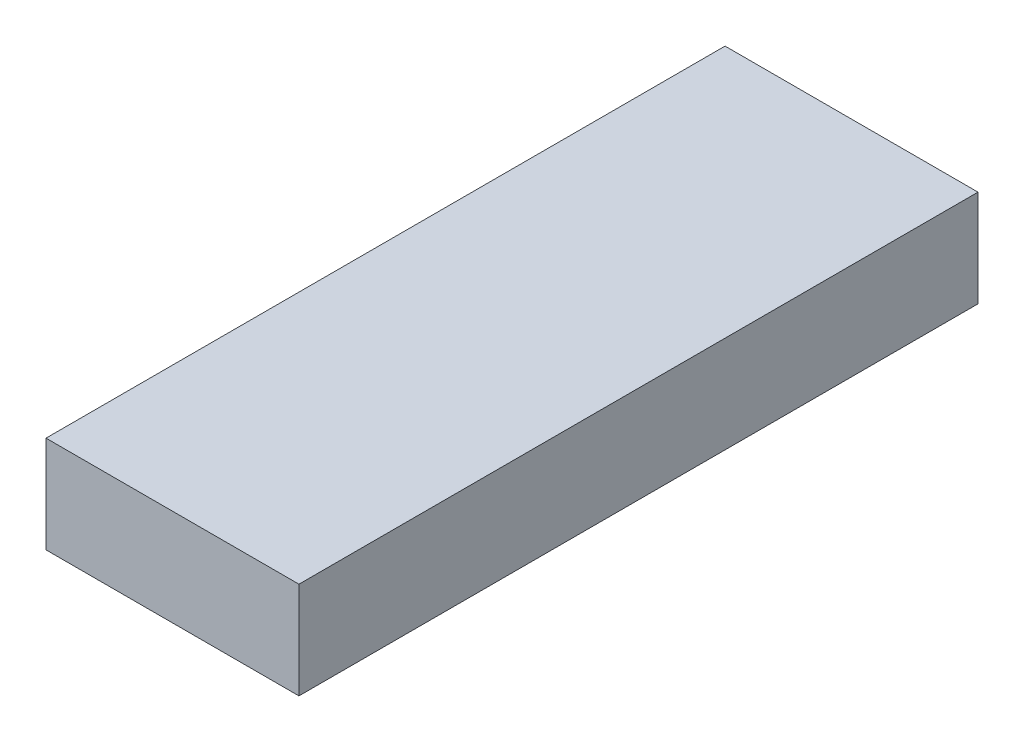
ISO-10303-21;
HEADER;
FILE_DESCRIPTION(('STEP AP214'),'2;1');
FILE_NAME('part.step','',(''),(''),'','','');
FILE_SCHEMA(('AUTOMOTIVE_DESIGN { 1 0 10303 214 1 1 1 1 }'));
ENDSEC;
DATA;
#1=APPLICATION_CONTEXT('core data for automotive mechanical design processes');
#2=APPLICATION_PROTOCOL_DEFINITION('international standard','automotive_design',2000,#1);
#3=PRODUCT_CONTEXT('',#1,'mechanical');
#4=PRODUCT('Part','Part','',(#3));
#5=PRODUCT_RELATED_PRODUCT_CATEGORY('part','',(#4));
#6=PRODUCT_DEFINITION_FORMATION('','',#4);
#7=PRODUCT_DEFINITION_CONTEXT('part definition',#1,'design');
#8=PRODUCT_DEFINITION('design','',#6,#7);
#9=PRODUCT_DEFINITION_SHAPE('','',#8);
#10=(LENGTH_UNIT() NAMED_UNIT(*) SI_UNIT(.MILLI.,.METRE.));
#11=(NAMED_UNIT(*) PLANE_ANGLE_UNIT() SI_UNIT($,.RADIAN.));
#12=(NAMED_UNIT(*) SI_UNIT($,.STERADIAN.) SOLID_ANGLE_UNIT());
#13=UNCERTAINTY_MEASURE_WITH_UNIT(LENGTH_MEASURE(1.E-05),#10,'distance_accuracy_value','');
#14=(GEOMETRIC_REPRESENTATION_CONTEXT(3) GLOBAL_UNCERTAINTY_ASSIGNED_CONTEXT((#13)) GLOBAL_UNIT_ASSIGNED_CONTEXT((#10,
#11,#12)) REPRESENTATION_CONTEXT('',''));
#15=CARTESIAN_POINT('',(0.,0.,0.));
#16=DIRECTION('',(0.,0.,1.));
#17=DIRECTION('',(1.,0.,0.));
#18=AXIS2_PLACEMENT_3D('',#15,#16,#17);
#19=CARTESIAN_POINT('',(-36.9638350449207,14.478,-19.5876732716674));
#20=DIRECTION('',(1.,0.,0.));
#21=DIRECTION('',(0.,0.,-1.));
#22=AXIS2_PLACEMENT_3D('',#19,#20,#21);
#23=PLANE('',#22);
#24=DIRECTION('',(0.,0.,1.));
#25=VECTOR('',#24,1.);
#26=CARTESIAN_POINT('',(-36.9638350449207,0.,-19.5876732716674));
#27=LINE('',#26,#25);
#28=CARTESIAN_POINT('',(-36.9638350449207,0.,-19.5876732716674));
#29=VERTEX_POINT('',#28);
#30=CARTESIAN_POINT('',(-36.9638350449207,0.,82.0123267283326));
#31=VERTEX_POINT('',#30);
#32=EDGE_CURVE('E94',#29,#31,#27,.T.);
#33=ORIENTED_EDGE('',*,*,#32,.T.);
#34=DIRECTION('',(0.,-1.,0.));
#35=VECTOR('',#34,1.);
#36=CARTESIAN_POINT('',(-36.9638350449207,14.478,82.0123267283326));
#37=LINE('',#36,#35);
#38=CARTESIAN_POINT('',(-36.9638350449207,14.478,82.0123267283326));
#39=VERTEX_POINT('',#38);
#40=EDGE_CURVE('E11',#39,#31,#37,.T.);
#41=ORIENTED_EDGE('',*,*,#40,.F.);
#42=DIRECTION('',(0.,0.,1.));
#43=VECTOR('',#42,1.);
#44=CARTESIAN_POINT('',(-36.9638350449207,14.478,-19.5876732716674));
#45=LINE('',#44,#43);
#46=CARTESIAN_POINT('',(-36.9638350449207,14.478,-19.5876732716674));
#47=VERTEX_POINT('',#46);
#48=EDGE_CURVE('E82',#47,#39,#45,.T.);
#49=ORIENTED_EDGE('',*,*,#48,.F.);
#50=DIRECTION('',(0.,-1.,0.));
#51=VECTOR('',#50,1.);
#52=CARTESIAN_POINT('',(-36.9638350449207,14.478,-19.5876732716674));
#53=LINE('',#52,#51);
#54=EDGE_CURVE('E90',#47,#29,#53,.T.);
#55=ORIENTED_EDGE('',*,*,#54,.T.);
#56=EDGE_LOOP('',(#33,#41,#49,#55));
#57=FACE_BOUND('',#56,.T.);
#58=ADVANCED_FACE('F31',(#57),#23,.F.);
#59=CARTESIAN_POINT('',(-36.9638350449207,14.478,82.0123267283326));
#60=DIRECTION('',(0.,0.,-1.));
#61=DIRECTION('',(-1.,0.,0.));
#62=AXIS2_PLACEMENT_3D('',#59,#60,#61);
#63=PLANE('',#62);
#64=DIRECTION('',(1.,0.,0.));
#65=VECTOR('',#64,1.);
#66=CARTESIAN_POINT('',(-36.9638350449207,0.,82.0123267283326));
#67=LINE('',#66,#65);
#68=CARTESIAN_POINT('',(0.882164955079324,0.,82.0123267283326));
#69=VERTEX_POINT('',#68);
#70=EDGE_CURVE('E86',#31,#69,#67,.T.);
#71=ORIENTED_EDGE('',*,*,#70,.T.);
#72=DIRECTION('',(0.,-1.,0.));
#73=VECTOR('',#72,1.);
#74=CARTESIAN_POINT('',(0.882164955079324,14.478,82.0123267283326));
#75=LINE('',#74,#73);
#76=CARTESIAN_POINT('',(0.882164955079324,14.478,82.0123267283326));
#77=VERTEX_POINT('',#76);
#78=EDGE_CURVE('E39',#77,#69,#75,.T.);
#79=ORIENTED_EDGE('',*,*,#78,.F.);
#80=DIRECTION('',(1.,0.,0.));
#81=VECTOR('',#80,1.);
#82=CARTESIAN_POINT('',(-36.9638350449207,14.478,82.0123267283326));
#83=LINE('',#82,#81);
#84=EDGE_CURVE('E77',#39,#77,#83,.T.);
#85=ORIENTED_EDGE('',*,*,#84,.F.);
#86=ORIENTED_EDGE('',*,*,#40,.T.);
#87=EDGE_LOOP('',(#71,#79,#85,#86));
#88=FACE_BOUND('',#87,.T.);
#89=ADVANCED_FACE('F85',(#88),#63,.F.);
#90=CARTESIAN_POINT('',(0.882164955079312,14.478,-19.5876732716674));
#91=DIRECTION('',(-1.,0.,0.));
#92=DIRECTION('',(0.,0.,1.));
#93=AXIS2_PLACEMENT_3D('',#90,#91,#92);
#94=PLANE('',#93);
#95=DIRECTION('',(0.,0.,-1.));
#96=VECTOR('',#95,1.);
#97=CARTESIAN_POINT('',(0.882164955079312,0.,-19.5876732716674));
#98=LINE('',#97,#96);
#99=CARTESIAN_POINT('',(0.882164955079312,0.,-19.5876732716674));
#100=VERTEX_POINT('',#99);
#101=EDGE_CURVE('E64',#69,#100,#98,.T.);
#102=ORIENTED_EDGE('',*,*,#101,.T.);
#103=DIRECTION('',(0.,-1.,0.));
#104=VECTOR('',#103,1.);
#105=CARTESIAN_POINT('',(0.882164955079312,14.478,-19.5876732716674));
#106=LINE('',#105,#104);
#107=CARTESIAN_POINT('',(0.882164955079312,14.478,-19.5876732716674));
#108=VERTEX_POINT('',#107);
#109=EDGE_CURVE('E87',#108,#100,#106,.T.);
#110=ORIENTED_EDGE('',*,*,#109,.F.);
#111=DIRECTION('',(0.,0.,-1.));
#112=VECTOR('',#111,1.);
#113=CARTESIAN_POINT('',(0.882164955079312,14.478,-19.5876732716674));
#114=LINE('',#113,#112);
#115=EDGE_CURVE('E80',#77,#108,#114,.T.);
#116=ORIENTED_EDGE('',*,*,#115,.F.);
#117=ORIENTED_EDGE('',*,*,#78,.T.);
#118=EDGE_LOOP('',(#102,#110,#116,#117));
#119=FACE_BOUND('',#118,.T.);
#120=ADVANCED_FACE('F88',(#119),#94,.F.);
#121=CARTESIAN_POINT('',(-36.9638350449207,14.478,-19.5876732716674));
#122=DIRECTION('',(0.,0.,1.));
#123=DIRECTION('',(1.,0.,0.));
#124=AXIS2_PLACEMENT_3D('',#121,#122,#123);
#125=PLANE('',#124);
#126=DIRECTION('',(-1.,0.,0.));
#127=VECTOR('',#126,1.);
#128=CARTESIAN_POINT('',(-36.9638350449207,0.,-19.5876732716674));
#129=LINE('',#128,#127);
#130=EDGE_CURVE('E70',#100,#29,#129,.T.);
#131=ORIENTED_EDGE('',*,*,#130,.T.);
#132=ORIENTED_EDGE('',*,*,#54,.F.);
#133=DIRECTION('',(-1.,0.,0.));
#134=VECTOR('',#133,1.);
#135=CARTESIAN_POINT('',(-36.9638350449207,14.478,-19.5876732716674));
#136=LINE('',#135,#134);
#137=EDGE_CURVE('E47',#108,#47,#136,.T.);
#138=ORIENTED_EDGE('',*,*,#137,.F.);
#139=ORIENTED_EDGE('',*,*,#109,.T.);
#140=EDGE_LOOP('',(#131,#132,#138,#139));
#141=FACE_BOUND('',#140,.T.);
#142=ADVANCED_FACE('F101',(#141),#125,.F.);
#143=CARTESIAN_POINT('',(-36.9638350449207,14.478,82.0123267283326));
#144=DIRECTION('',(0.,1.,0.));
#145=DIRECTION('',(0.,0.,1.));
#146=AXIS2_PLACEMENT_3D('',#143,#144,#145);
#147=PLANE('',#146);
#148=ORIENTED_EDGE('',*,*,#48,.T.);
#149=ORIENTED_EDGE('',*,*,#84,.T.);
#150=ORIENTED_EDGE('',*,*,#115,.T.);
#151=ORIENTED_EDGE('',*,*,#137,.T.);
#152=EDGE_LOOP('',(#148,#149,#150,#151));
#153=FACE_BOUND('',#152,.T.);
#154=ADVANCED_FACE('F78',(#153),#147,.T.);
#155=CARTESIAN_POINT('',(-36.9638350449207,0.,82.0123267283326));
#156=DIRECTION('',(0.,1.,0.));
#157=DIRECTION('',(0.,0.,1.));
#158=AXIS2_PLACEMENT_3D('',#155,#156,#157);
#159=PLANE('',#158);
#160=ORIENTED_EDGE('',*,*,#32,.F.);
#161=ORIENTED_EDGE('',*,*,#130,.F.);
#162=ORIENTED_EDGE('',*,*,#101,.F.);
#163=ORIENTED_EDGE('',*,*,#70,.F.);
#164=EDGE_LOOP('',(#160,#161,#162,#163));
#165=FACE_BOUND('',#164,.T.);
#166=ADVANCED_FACE('F104',(#165),#159,.F.);
#167=CLOSED_SHELL('',(#58,#89,#120,#142,#154,#166));
#168=MANIFOLD_SOLID_BREP('B2',#167);
#169=ADVANCED_BREP_SHAPE_REPRESENTATION('',(#18,#168),#14);
#170=SHAPE_DEFINITION_REPRESENTATION(#9,#169);
ENDSEC;
END-ISO-10303-21;
